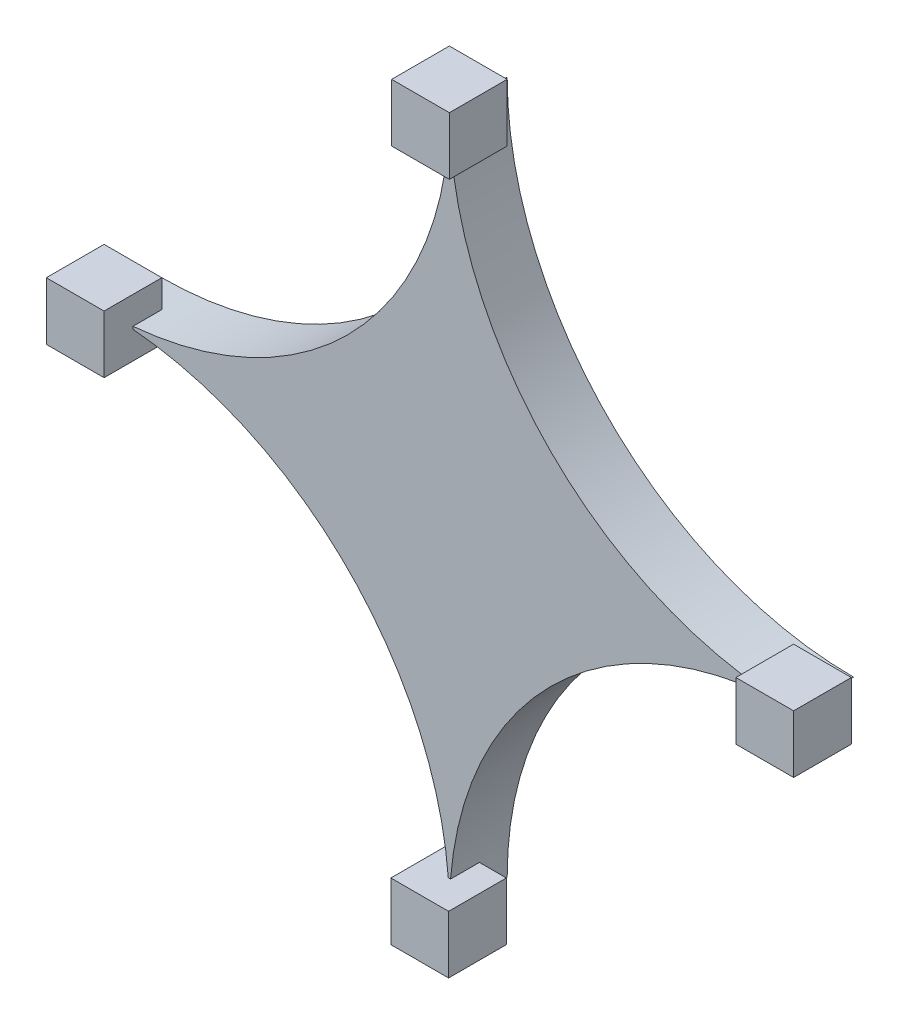
ISO-10303-21;
HEADER;
FILE_DESCRIPTION(('STEP AP214'),'2;1');
FILE_NAME('part.step','',(''),(''),'','','');
FILE_SCHEMA(('AUTOMOTIVE_DESIGN { 1 0 10303 214 1 1 1 1 }'));
ENDSEC;
DATA;
#1=APPLICATION_CONTEXT('core data for automotive mechanical design processes');
#2=APPLICATION_PROTOCOL_DEFINITION('international standard','automotive_design',2000,#1);
#3=PRODUCT_CONTEXT('',#1,'mechanical');
#4=PRODUCT('Part','Part','',(#3));
#5=PRODUCT_RELATED_PRODUCT_CATEGORY('part','',(#4));
#6=PRODUCT_DEFINITION_FORMATION('','',#4);
#7=PRODUCT_DEFINITION_CONTEXT('part definition',#1,'design');
#8=PRODUCT_DEFINITION('design','',#6,#7);
#9=PRODUCT_DEFINITION_SHAPE('','',#8);
#10=(LENGTH_UNIT() NAMED_UNIT(*) SI_UNIT(.MILLI.,.METRE.));
#11=(NAMED_UNIT(*) PLANE_ANGLE_UNIT() SI_UNIT($,.RADIAN.));
#12=(NAMED_UNIT(*) SI_UNIT($,.STERADIAN.) SOLID_ANGLE_UNIT());
#13=UNCERTAINTY_MEASURE_WITH_UNIT(LENGTH_MEASURE(1.E-05),#10,'distance_accuracy_value','');
#14=(GEOMETRIC_REPRESENTATION_CONTEXT(3) GLOBAL_UNCERTAINTY_ASSIGNED_CONTEXT((#13)) GLOBAL_UNIT_ASSIGNED_CONTEXT((#10,
#11,#12)) REPRESENTATION_CONTEXT('',''));
#15=CARTESIAN_POINT('',(0.,0.,0.));
#16=DIRECTION('',(0.,0.,1.));
#17=DIRECTION('',(1.,0.,0.));
#18=AXIS2_PLACEMENT_3D('',#15,#16,#17);
#19=CARTESIAN_POINT('',(-60.0000000000001,0.,10.));
#20=DIRECTION('',(0.,0.,1.));
#21=DIRECTION('',(1.,0.,0.));
#22=AXIS2_PLACEMENT_3D('',#19,#20,#21);
#23=PLANE('',#22);
#24=CARTESIAN_POINT('',(60.,60.,10.));
#25=DIRECTION('',(0.,0.,1.));
#26=DIRECTION('',(1.,0.,0.));
#27=AXIS2_PLACEMENT_3D('',#24,#25,#26);
#28=CIRCLE('',#27,60.);
#29=CARTESIAN_POINT('',(0.238878901161831,54.6513174509981,10.));
#30=VERTEX_POINT('',#29);
#31=CARTESIAN_POINT('',(54.6008487596363,0.243417384494973,10.));
#32=VERTEX_POINT('',#31);
#33=EDGE_CURVE('E380',#30,#32,#28,.T.);
#34=ORIENTED_EDGE('',*,*,#33,.F.);
#35=DIRECTION('',(-1.,0.,0.));
#36=VECTOR('',#35,1.);
#37=CARTESIAN_POINT('',(-60.0000000000001,54.6513174509981,10.));
#38=LINE('',#37,#36);
#39=CARTESIAN_POINT('',(-0.238878901161803,54.6513174509981,10.));
#40=VERTEX_POINT('',#39);
#41=EDGE_CURVE('E56',#30,#40,#38,.T.);
#42=ORIENTED_EDGE('',*,*,#41,.T.);
#43=CARTESIAN_POINT('',(-60.,60.,10.));
#44=DIRECTION('',(0.,0.,1.));
#45=DIRECTION('',(1.,0.,0.));
#46=AXIS2_PLACEMENT_3D('',#43,#44,#45);
#47=CIRCLE('',#46,60.);
#48=CARTESIAN_POINT('',(-54.7983305418478,0.225903312152609,10.));
#49=VERTEX_POINT('',#48);
#50=EDGE_CURVE('E377',#49,#40,#47,.T.);
#51=ORIENTED_EDGE('',*,*,#50,.F.);
#52=DIRECTION('',(0.,-1.,0.));
#53=VECTOR('',#52,1.);
#54=CARTESIAN_POINT('',(-54.7983305418478,0.,10.));
#55=LINE('',#54,#53);
#56=CARTESIAN_POINT('',(-54.7983305418478,-0.225903312152623,10.));
#57=VERTEX_POINT('',#56);
#58=EDGE_CURVE('E289',#49,#57,#55,.T.);
#59=ORIENTED_EDGE('',*,*,#58,.T.);
#60=CARTESIAN_POINT('',(-60.0000000000001,-60.0000000000001,10.));
#61=DIRECTION('',(0.,0.,1.));
#62=DIRECTION('',(1.,0.,0.));
#63=AXIS2_PLACEMENT_3D('',#60,#61,#62);
#64=CIRCLE('',#63,60.0000000000001);
#65=CARTESIAN_POINT('',(-0.193930264407352,-55.179831664617,10.));
#66=VERTEX_POINT('',#65);
#67=EDGE_CURVE('E374',#66,#57,#64,.T.);
#68=ORIENTED_EDGE('',*,*,#67,.F.);
#69=DIRECTION('',(1.,0.,0.));
#70=VECTOR('',#69,1.);
#71=CARTESIAN_POINT('',(-60.0000000000001,-55.179831664617,10.));
#72=LINE('',#71,#70);
#73=CARTESIAN_POINT('',(0.193930264407373,-55.179831664617,10.));
#74=VERTEX_POINT('',#73);
#75=EDGE_CURVE('E397',#66,#74,#72,.T.);
#76=ORIENTED_EDGE('',*,*,#75,.T.);
#77=CARTESIAN_POINT('',(60.0000000000001,-60.0000000000001,10.));
#78=DIRECTION('',(0.,0.,1.));
#79=DIRECTION('',(1.,0.,0.));
#80=AXIS2_PLACEMENT_3D('',#77,#78,#79);
#81=CIRCLE('',#80,60.0000000000001);
#82=CARTESIAN_POINT('',(54.6008487596363,-0.243417384494959,10.));
#83=VERTEX_POINT('',#82);
#84=EDGE_CURVE('E382',#83,#74,#81,.T.);
#85=ORIENTED_EDGE('',*,*,#84,.F.);
#86=DIRECTION('',(0.,1.,0.));
#87=VECTOR('',#86,1.);
#88=CARTESIAN_POINT('',(54.6008487596363,0.,10.));
#89=LINE('',#88,#87);
#90=EDGE_CURVE('E328',#83,#32,#89,.T.);
#91=ORIENTED_EDGE('',*,*,#90,.T.);
#92=EDGE_LOOP('',(#34,#42,#51,#59,#68,#76,#85,#91));
#93=FACE_BOUND('',#92,.T.);
#94=ADVANCED_FACE('F33',(#93),#23,.T.);
#95=CARTESIAN_POINT('',(-60.,60.,10.));
#96=DIRECTION('',(0.,0.,-1.));
#97=DIRECTION('',(-1.,0.,0.));
#98=AXIS2_PLACEMENT_3D('',#95,#96,#97);
#99=CYLINDRICAL_SURFACE('',#98,60.);
#100=ORIENTED_EDGE('',*,*,#50,.T.);
#101=DIRECTION('',(0.,0.,-1.));
#102=VECTOR('',#101,1.);
#103=CARTESIAN_POINT('',(-0.238878901161803,54.6513174509981,10.));
#104=LINE('',#103,#102);
#105=CARTESIAN_POINT('',(-0.238878901161803,54.6513174509981,5.));
#106=VERTEX_POINT('',#105);
#107=EDGE_CURVE('E48',#40,#106,#104,.T.);
#108=ORIENTED_EDGE('',*,*,#107,.T.);
#109=CARTESIAN_POINT('',(-60.,60.,5.));
#110=DIRECTION('',(0.,0.,-1.));
#111=DIRECTION('',(-1.,0.,0.));
#112=AXIS2_PLACEMENT_3D('',#109,#110,#111);
#113=CIRCLE('',#112,60.);
#114=CARTESIAN_POINT('',(0.,60.,5.));
#115=VERTEX_POINT('',#114);
#116=EDGE_CURVE('E245',#115,#106,#113,.T.);
#117=ORIENTED_EDGE('',*,*,#116,.F.);
#118=DIRECTION('',(0.,0.,-1.));
#119=VECTOR('',#118,1.);
#120=CARTESIAN_POINT('',(0.,60.,10.));
#121=LINE('',#120,#119);
#122=CARTESIAN_POINT('',(0.,60.,0.));
#123=VERTEX_POINT('',#122);
#124=EDGE_CURVE('E400',#115,#123,#121,.T.);
#125=ORIENTED_EDGE('',*,*,#124,.T.);
#126=CARTESIAN_POINT('',(-60.,60.,0.));
#127=DIRECTION('',(0.,0.,1.));
#128=DIRECTION('',(1.,0.,0.));
#129=AXIS2_PLACEMENT_3D('',#126,#127,#128);
#130=CIRCLE('',#129,60.);
#131=CARTESIAN_POINT('',(-60.,0.,0.));
#132=VERTEX_POINT('',#131);
#133=EDGE_CURVE('E387',#132,#123,#130,.T.);
#134=ORIENTED_EDGE('',*,*,#133,.F.);
#135=DIRECTION('',(0.,0.,-1.));
#136=VECTOR('',#135,1.);
#137=CARTESIAN_POINT('',(-60.,0.,10.));
#138=LINE('',#137,#136);
#139=CARTESIAN_POINT('',(-60.,0.,5.));
#140=VERTEX_POINT('',#139);
#141=EDGE_CURVE('E384',#140,#132,#138,.T.);
#142=ORIENTED_EDGE('',*,*,#141,.F.);
#143=CARTESIAN_POINT('',(-60.,60.,5.));
#144=DIRECTION('',(0.,0.,-1.));
#145=DIRECTION('',(-1.,0.,0.));
#146=AXIS2_PLACEMENT_3D('',#143,#144,#145);
#147=CIRCLE('',#146,60.);
#148=CARTESIAN_POINT('',(-54.7983305418478,0.225903312152623,5.));
#149=VERTEX_POINT('',#148);
#150=EDGE_CURVE('E412',#149,#140,#147,.T.);
#151=ORIENTED_EDGE('',*,*,#150,.F.);
#152=DIRECTION('',(0.,0.,-1.));
#153=VECTOR('',#152,1.);
#154=CARTESIAN_POINT('',(-54.7983305418478,0.225903312152623,10.));
#155=LINE('',#154,#153);
#156=EDGE_CURVE('E415',#149,#49,#155,.F.);
#157=ORIENTED_EDGE('',*,*,#156,.T.);
#158=EDGE_LOOP('',(#100,#108,#117,#125,#134,#142,#151,#157));
#159=FACE_BOUND('',#158,.T.);
#160=ADVANCED_FACE('F453',(#159),#99,.F.);
#161=CARTESIAN_POINT('',(60.,60.,10.));
#162=DIRECTION('',(0.,0.,-1.));
#163=DIRECTION('',(-1.,0.,0.));
#164=AXIS2_PLACEMENT_3D('',#161,#162,#163);
#165=CYLINDRICAL_SURFACE('',#164,60.);
#166=CARTESIAN_POINT('',(60.,60.,5.));
#167=DIRECTION('',(0.,0.,-1.));
#168=DIRECTION('',(-1.,0.,0.));
#169=AXIS2_PLACEMENT_3D('',#166,#167,#168);
#170=CIRCLE('',#169,60.);
#171=CARTESIAN_POINT('',(0.238878901161831,54.6513174509981,5.));
#172=VERTEX_POINT('',#171);
#173=EDGE_CURVE('E41',#172,#115,#170,.T.);
#174=ORIENTED_EDGE('',*,*,#173,.F.);
#175=DIRECTION('',(0.,0.,-1.));
#176=VECTOR('',#175,1.);
#177=CARTESIAN_POINT('',(0.238878901161831,54.6513174509981,10.));
#178=LINE('',#177,#176);
#179=EDGE_CURVE('E11',#172,#30,#178,.F.);
#180=ORIENTED_EDGE('',*,*,#179,.T.);
#181=ORIENTED_EDGE('',*,*,#33,.T.);
#182=DIRECTION('',(0.,0.,-1.));
#183=VECTOR('',#182,1.);
#184=CARTESIAN_POINT('',(54.6008487596363,0.243417384494973,10.));
#185=LINE('',#184,#183);
#186=CARTESIAN_POINT('',(54.6008487596363,0.243417384494973,5.));
#187=VERTEX_POINT('',#186);
#188=EDGE_CURVE('E410',#32,#187,#185,.T.);
#189=ORIENTED_EDGE('',*,*,#188,.T.);
#190=CARTESIAN_POINT('',(60.,60.,5.));
#191=DIRECTION('',(0.,0.,-1.));
#192=DIRECTION('',(-1.,0.,0.));
#193=AXIS2_PLACEMENT_3D('',#190,#191,#192);
#194=CIRCLE('',#193,60.);
#195=CARTESIAN_POINT('',(60.,0.,5.));
#196=VERTEX_POINT('',#195);
#197=EDGE_CURVE('E407',#196,#187,#194,.T.);
#198=ORIENTED_EDGE('',*,*,#197,.F.);
#199=DIRECTION('',(0.,0.,-1.));
#200=VECTOR('',#199,1.);
#201=CARTESIAN_POINT('',(60.,0.,10.));
#202=LINE('',#201,#200);
#203=CARTESIAN_POINT('',(60.,0.,0.));
#204=VERTEX_POINT('',#203);
#205=EDGE_CURVE('E398',#196,#204,#202,.T.);
#206=ORIENTED_EDGE('',*,*,#205,.T.);
#207=CARTESIAN_POINT('',(60.,60.,0.));
#208=DIRECTION('',(0.,0.,1.));
#209=DIRECTION('',(1.,0.,0.));
#210=AXIS2_PLACEMENT_3D('',#207,#208,#209);
#211=CIRCLE('',#210,60.);
#212=EDGE_CURVE('E390',#123,#204,#211,.T.);
#213=ORIENTED_EDGE('',*,*,#212,.F.);
#214=ORIENTED_EDGE('',*,*,#124,.F.);
#215=EDGE_LOOP('',(#174,#180,#181,#189,#198,#206,#213,#214));
#216=FACE_BOUND('',#215,.T.);
#217=ADVANCED_FACE('F425',(#216),#165,.F.);
#218=CARTESIAN_POINT('',(-60.0000000000001,-60.0000000000001,10.));
#219=DIRECTION('',(0.,0.,-1.));
#220=DIRECTION('',(-1.,0.,0.));
#221=AXIS2_PLACEMENT_3D('',#218,#219,#220);
#222=CYLINDRICAL_SURFACE('',#221,60.0000000000001);
#223=ORIENTED_EDGE('',*,*,#67,.T.);
#224=DIRECTION('',(0.,0.,-1.));
#225=VECTOR('',#224,1.);
#226=CARTESIAN_POINT('',(-54.7983305418478,-0.225903312152637,10.));
#227=LINE('',#226,#225);
#228=CARTESIAN_POINT('',(-54.7983305418478,-0.225903312152637,5.));
#229=VERTEX_POINT('',#228);
#230=EDGE_CURVE('E291',#57,#229,#227,.T.);
#231=ORIENTED_EDGE('',*,*,#230,.T.);
#232=CARTESIAN_POINT('',(-60.0000000000001,-60.0000000000001,5.));
#233=DIRECTION('',(0.,0.,-1.));
#234=DIRECTION('',(-1.,0.,0.));
#235=AXIS2_PLACEMENT_3D('',#232,#233,#234);
#236=CIRCLE('',#235,60.0000000000001);
#237=EDGE_CURVE('E286',#140,#229,#236,.T.);
#238=ORIENTED_EDGE('',*,*,#237,.F.);
#239=ORIENTED_EDGE('',*,*,#141,.T.);
#240=CARTESIAN_POINT('',(-60.0000000000001,-60.0000000000001,0.));
#241=DIRECTION('',(0.,0.,1.));
#242=DIRECTION('',(1.,0.,0.));
#243=AXIS2_PLACEMENT_3D('',#240,#241,#242);
#244=CIRCLE('',#243,60.0000000000001);
#245=CARTESIAN_POINT('',(0.,-60.,0.));
#246=VERTEX_POINT('',#245);
#247=EDGE_CURVE('E373',#246,#132,#244,.T.);
#248=ORIENTED_EDGE('',*,*,#247,.F.);
#249=DIRECTION('',(0.,0.,-1.));
#250=VECTOR('',#249,1.);
#251=CARTESIAN_POINT('',(0.,-60.,10.));
#252=LINE('',#251,#250);
#253=CARTESIAN_POINT('',(0.,-60.0000000000001,5.));
#254=VERTEX_POINT('',#253);
#255=EDGE_CURVE('E395',#254,#246,#252,.T.);
#256=ORIENTED_EDGE('',*,*,#255,.F.);
#257=CARTESIAN_POINT('',(-60.0000000000001,-60.0000000000001,5.));
#258=DIRECTION('',(0.,0.,-1.));
#259=DIRECTION('',(-1.,0.,0.));
#260=AXIS2_PLACEMENT_3D('',#257,#258,#259);
#261=CIRCLE('',#260,60.0000000000001);
#262=CARTESIAN_POINT('',(-0.193930264407352,-55.179831664617,5.));
#263=VERTEX_POINT('',#262);
#264=EDGE_CURVE('E371',#263,#254,#261,.T.);
#265=ORIENTED_EDGE('',*,*,#264,.F.);
#266=DIRECTION('',(0.,0.,-1.));
#267=VECTOR('',#266,1.);
#268=CARTESIAN_POINT('',(-0.193930264407352,-55.179831664617,10.));
#269=LINE('',#268,#267);
#270=EDGE_CURVE('E368',#263,#66,#269,.F.);
#271=ORIENTED_EDGE('',*,*,#270,.T.);
#272=EDGE_LOOP('',(#223,#231,#238,#239,#248,#256,#265,#271));
#273=FACE_BOUND('',#272,.T.);
#274=ADVANCED_FACE('F35',(#273),#222,.F.);
#275=CARTESIAN_POINT('',(60.0000000000001,-60.0000000000001,10.));
#276=DIRECTION('',(0.,0.,-1.));
#277=DIRECTION('',(-1.,0.,0.));
#278=AXIS2_PLACEMENT_3D('',#275,#276,#277);
#279=CYLINDRICAL_SURFACE('',#278,60.0000000000001);
#280=CARTESIAN_POINT('',(60.0000000000001,-60.0000000000001,5.));
#281=DIRECTION('',(0.,0.,-1.));
#282=DIRECTION('',(-1.,0.,0.));
#283=AXIS2_PLACEMENT_3D('',#280,#281,#282);
#284=CIRCLE('',#283,60.0000000000001);
#285=CARTESIAN_POINT('',(54.6008487596363,-0.243417384494959,5.));
#286=VERTEX_POINT('',#285);
#287=EDGE_CURVE('E325',#286,#196,#284,.T.);
#288=ORIENTED_EDGE('',*,*,#287,.F.);
#289=DIRECTION('',(0.,0.,-1.));
#290=VECTOR('',#289,1.);
#291=CARTESIAN_POINT('',(54.6008487596363,-0.243417384494959,10.));
#292=LINE('',#291,#290);
#293=EDGE_CURVE('E331',#286,#83,#292,.F.);
#294=ORIENTED_EDGE('',*,*,#293,.T.);
#295=ORIENTED_EDGE('',*,*,#84,.T.);
#296=DIRECTION('',(0.,0.,-1.));
#297=VECTOR('',#296,1.);
#298=CARTESIAN_POINT('',(0.193930264407373,-55.179831664617,10.));
#299=LINE('',#298,#297);
#300=CARTESIAN_POINT('',(0.193930264407373,-55.179831664617,5.));
#301=VERTEX_POINT('',#300);
#302=EDGE_CURVE('E365',#74,#301,#299,.T.);
#303=ORIENTED_EDGE('',*,*,#302,.T.);
#304=CARTESIAN_POINT('',(60.0000000000001,-60.0000000000001,5.));
#305=DIRECTION('',(0.,0.,-1.));
#306=DIRECTION('',(-1.,0.,0.));
#307=AXIS2_PLACEMENT_3D('',#304,#305,#306);
#308=CIRCLE('',#307,60.0000000000001);
#309=EDGE_CURVE('E405',#254,#301,#308,.T.);
#310=ORIENTED_EDGE('',*,*,#309,.F.);
#311=ORIENTED_EDGE('',*,*,#255,.T.);
#312=CARTESIAN_POINT('',(60.0000000000001,-60.0000000000001,0.));
#313=DIRECTION('',(0.,0.,1.));
#314=DIRECTION('',(1.,0.,0.));
#315=AXIS2_PLACEMENT_3D('',#312,#313,#314);
#316=CIRCLE('',#315,60.0000000000001);
#317=EDGE_CURVE('E378',#204,#246,#316,.T.);
#318=ORIENTED_EDGE('',*,*,#317,.F.);
#319=ORIENTED_EDGE('',*,*,#205,.F.);
#320=EDGE_LOOP('',(#288,#294,#295,#303,#310,#311,#318,#319));
#321=FACE_BOUND('',#320,.T.);
#322=ADVANCED_FACE('F466',(#321),#279,.F.);
#323=CARTESIAN_POINT('',(-60.0000000000001,0.,0.));
#324=DIRECTION('',(0.,0.,1.));
#325=DIRECTION('',(1.,0.,0.));
#326=AXIS2_PLACEMENT_3D('',#323,#324,#325);
#327=PLANE('',#326);
#328=ORIENTED_EDGE('',*,*,#247,.T.);
#329=ORIENTED_EDGE('',*,*,#133,.T.);
#330=ORIENTED_EDGE('',*,*,#212,.T.);
#331=ORIENTED_EDGE('',*,*,#317,.T.);
#332=EDGE_LOOP('',(#328,#329,#330,#331));
#333=FACE_BOUND('',#332,.T.);
#334=ADVANCED_FACE('F462',(#333),#327,.F.);
#335=CARTESIAN_POINT('',(0.,0.,5.));
#336=DIRECTION('',(0.,0.,-1.));
#337=DIRECTION('',(-1.,0.,0.));
#338=AXIS2_PLACEMENT_3D('',#335,#336,#337);
#339=PLANE('',#338);
#340=DIRECTION('',(-1.,0.,0.));
#341=VECTOR('',#340,1.);
#342=CARTESIAN_POINT('',(4.85863422704114,-55.179831664617,5.));
#343=LINE('',#342,#341);
#344=CARTESIAN_POINT('',(-5.14136577295886,-55.179831664617,5.));
#345=VERTEX_POINT('',#344);
#346=EDGE_CURVE('E347',#263,#345,#343,.T.);
#347=ORIENTED_EDGE('',*,*,#346,.F.);
#348=ORIENTED_EDGE('',*,*,#264,.T.);
#349=ORIENTED_EDGE('',*,*,#309,.T.);
#350=CARTESIAN_POINT('',(4.85863422704114,-55.179831664617,5.));
#351=VERTEX_POINT('',#350);
#352=EDGE_CURVE('E348',#351,#301,#343,.T.);
#353=ORIENTED_EDGE('',*,*,#352,.F.);
#354=DIRECTION('',(0.,1.,0.));
#355=VECTOR('',#354,1.);
#356=CARTESIAN_POINT('',(4.85863422704114,-55.179831664617,5.));
#357=LINE('',#356,#355);
#358=CARTESIAN_POINT('',(4.85863422704114,-65.1798316646171,5.));
#359=VERTEX_POINT('',#358);
#360=EDGE_CURVE('E333',#359,#351,#357,.T.);
#361=ORIENTED_EDGE('',*,*,#360,.F.);
#362=DIRECTION('',(1.,0.,0.));
#363=VECTOR('',#362,1.);
#364=CARTESIAN_POINT('',(4.85863422704114,-65.1798316646171,5.));
#365=LINE('',#364,#363);
#366=CARTESIAN_POINT('',(-5.14136577295886,-65.1798316646171,5.));
#367=VERTEX_POINT('',#366);
#368=EDGE_CURVE('E338',#367,#359,#365,.T.);
#369=ORIENTED_EDGE('',*,*,#368,.F.);
#370=DIRECTION('',(0.,-1.,0.));
#371=VECTOR('',#370,1.);
#372=CARTESIAN_POINT('',(-5.14136577295886,-55.179831664617,5.));
#373=LINE('',#372,#371);
#374=EDGE_CURVE('E351',#345,#367,#373,.T.);
#375=ORIENTED_EDGE('',*,*,#374,.F.);
#376=EDGE_LOOP('',(#347,#348,#349,#353,#361,#369,#375));
#377=FACE_BOUND('',#376,.T.);
#378=ADVANCED_FACE('F465',(#377),#339,.T.);
#379=CARTESIAN_POINT('',(4.85863422704114,-55.179831664617,15.));
#380=DIRECTION('',(-1.,0.,0.));
#381=DIRECTION('',(0.,0.,1.));
#382=AXIS2_PLACEMENT_3D('',#379,#380,#381);
#383=PLANE('',#382);
#384=ORIENTED_EDGE('',*,*,#360,.T.);
#385=DIRECTION('',(0.,0.,-1.));
#386=VECTOR('',#385,1.);
#387=CARTESIAN_POINT('',(4.85863422704114,-55.179831664617,15.));
#388=LINE('',#387,#386);
#389=CARTESIAN_POINT('',(4.85863422704114,-55.179831664617,15.));
#390=VERTEX_POINT('',#389);
#391=EDGE_CURVE('E362',#390,#351,#388,.T.);
#392=ORIENTED_EDGE('',*,*,#391,.F.);
#393=DIRECTION('',(0.,1.,0.));
#394=VECTOR('',#393,1.);
#395=CARTESIAN_POINT('',(4.85863422704114,-55.179831664617,15.));
#396=LINE('',#395,#394);
#397=CARTESIAN_POINT('',(4.85863422704114,-65.1798316646171,15.));
#398=VERTEX_POINT('',#397);
#399=EDGE_CURVE('E334',#398,#390,#396,.T.);
#400=ORIENTED_EDGE('',*,*,#399,.F.);
#401=DIRECTION('',(0.,0.,-1.));
#402=VECTOR('',#401,1.);
#403=CARTESIAN_POINT('',(4.85863422704114,-65.1798316646171,15.));
#404=LINE('',#403,#402);
#405=EDGE_CURVE('E344',#398,#359,#404,.T.);
#406=ORIENTED_EDGE('',*,*,#405,.T.);
#407=EDGE_LOOP('',(#384,#392,#400,#406));
#408=FACE_BOUND('',#407,.T.);
#409=ADVANCED_FACE('F460',(#408),#383,.F.);
#410=CARTESIAN_POINT('',(4.85863422704114,-55.179831664617,15.));
#411=DIRECTION('',(0.,-1.,0.));
#412=DIRECTION('',(0.,0.,-1.));
#413=AXIS2_PLACEMENT_3D('',#410,#411,#412);
#414=PLANE('',#413);
#415=ORIENTED_EDGE('',*,*,#270,.F.);
#416=ORIENTED_EDGE('',*,*,#346,.T.);
#417=DIRECTION('',(0.,0.,-1.));
#418=VECTOR('',#417,1.);
#419=CARTESIAN_POINT('',(-5.14136577295886,-55.179831664617,15.));
#420=LINE('',#419,#418);
#421=CARTESIAN_POINT('',(-5.14136577295886,-55.179831664617,15.));
#422=VERTEX_POINT('',#421);
#423=EDGE_CURVE('E359',#422,#345,#420,.T.);
#424=ORIENTED_EDGE('',*,*,#423,.F.);
#425=DIRECTION('',(-1.,0.,0.));
#426=VECTOR('',#425,1.);
#427=CARTESIAN_POINT('',(4.85863422704114,-55.179831664617,15.));
#428=LINE('',#427,#426);
#429=EDGE_CURVE('E337',#390,#422,#428,.T.);
#430=ORIENTED_EDGE('',*,*,#429,.F.);
#431=ORIENTED_EDGE('',*,*,#391,.T.);
#432=ORIENTED_EDGE('',*,*,#352,.T.);
#433=ORIENTED_EDGE('',*,*,#302,.F.);
#434=ORIENTED_EDGE('',*,*,#75,.F.);
#435=EDGE_LOOP('',(#415,#416,#424,#430,#431,#432,#433,#434));
#436=FACE_BOUND('',#435,.T.);
#437=ADVANCED_FACE('F505',(#436),#414,.F.);
#438=CARTESIAN_POINT('',(-5.14136577295886,-55.179831664617,15.));
#439=DIRECTION('',(1.,0.,0.));
#440=DIRECTION('',(0.,1.,0.));
#441=AXIS2_PLACEMENT_3D('',#438,#439,#440);
#442=PLANE('',#441);
#443=ORIENTED_EDGE('',*,*,#374,.T.);
#444=DIRECTION('',(0.,0.,-1.));
#445=VECTOR('',#444,1.);
#446=CARTESIAN_POINT('',(-5.14136577295886,-65.1798316646171,15.));
#447=LINE('',#446,#445);
#448=CARTESIAN_POINT('',(-5.14136577295886,-65.1798316646171,15.));
#449=VERTEX_POINT('',#448);
#450=EDGE_CURVE('E356',#449,#367,#447,.T.);
#451=ORIENTED_EDGE('',*,*,#450,.F.);
#452=DIRECTION('',(0.,-1.,0.));
#453=VECTOR('',#452,1.);
#454=CARTESIAN_POINT('',(-5.14136577295886,-55.179831664617,15.));
#455=LINE('',#454,#453);
#456=EDGE_CURVE('E340',#422,#449,#455,.T.);
#457=ORIENTED_EDGE('',*,*,#456,.F.);
#458=ORIENTED_EDGE('',*,*,#423,.T.);
#459=EDGE_LOOP('',(#443,#451,#457,#458));
#460=FACE_BOUND('',#459,.T.);
#461=ADVANCED_FACE('F508',(#460),#442,.F.);
#462=CARTESIAN_POINT('',(4.85863422704114,-65.1798316646171,15.));
#463=DIRECTION('',(0.,1.,0.));
#464=DIRECTION('',(0.,0.,1.));
#465=AXIS2_PLACEMENT_3D('',#462,#463,#464);
#466=PLANE('',#465);
#467=ORIENTED_EDGE('',*,*,#368,.T.);
#468=ORIENTED_EDGE('',*,*,#405,.F.);
#469=DIRECTION('',(1.,0.,0.));
#470=VECTOR('',#469,1.);
#471=CARTESIAN_POINT('',(4.85863422704114,-65.1798316646171,15.));
#472=LINE('',#471,#470);
#473=EDGE_CURVE('E342',#449,#398,#472,.T.);
#474=ORIENTED_EDGE('',*,*,#473,.F.);
#475=ORIENTED_EDGE('',*,*,#450,.T.);
#476=EDGE_LOOP('',(#467,#468,#474,#475));
#477=FACE_BOUND('',#476,.T.);
#478=ADVANCED_FACE('F520',(#477),#466,.F.);
#479=CARTESIAN_POINT('',(0.,0.,15.));
#480=DIRECTION('',(0.,0.,-1.));
#481=DIRECTION('',(-1.,0.,0.));
#482=AXIS2_PLACEMENT_3D('',#479,#480,#481);
#483=PLANE('',#482);
#484=ORIENTED_EDGE('',*,*,#399,.T.);
#485=ORIENTED_EDGE('',*,*,#429,.T.);
#486=ORIENTED_EDGE('',*,*,#456,.T.);
#487=ORIENTED_EDGE('',*,*,#473,.T.);
#488=EDGE_LOOP('',(#484,#485,#486,#487));
#489=FACE_BOUND('',#488,.T.);
#490=ADVANCED_FACE('F512',(#489),#483,.F.);
#491=CARTESIAN_POINT('',(0.,0.,5.));
#492=DIRECTION('',(0.,0.,-1.));
#493=DIRECTION('',(-1.,0.,0.));
#494=AXIS2_PLACEMENT_3D('',#491,#492,#493);
#495=PLANE('',#494);
#496=DIRECTION('',(0.,-1.,0.));
#497=VECTOR('',#496,1.);
#498=CARTESIAN_POINT('',(54.6008487596363,4.75538839912758,5.));
#499=LINE('',#498,#497);
#500=CARTESIAN_POINT('',(54.6008487596363,-5.24461160087242,5.));
#501=VERTEX_POINT('',#500);
#502=EDGE_CURVE('E309',#286,#501,#499,.T.);
#503=ORIENTED_EDGE('',*,*,#502,.F.);
#504=ORIENTED_EDGE('',*,*,#287,.T.);
#505=ORIENTED_EDGE('',*,*,#197,.T.);
#506=CARTESIAN_POINT('',(54.6008487596363,4.75538839912758,5.));
#507=VERTEX_POINT('',#506);
#508=EDGE_CURVE('E310',#507,#187,#499,.T.);
#509=ORIENTED_EDGE('',*,*,#508,.F.);
#510=DIRECTION('',(-1.,0.,0.));
#511=VECTOR('',#510,1.);
#512=CARTESIAN_POINT('',(64.6008487596363,4.75538839912758,5.));
#513=LINE('',#512,#511);
#514=CARTESIAN_POINT('',(64.6008487596363,4.75538839912758,5.));
#515=VERTEX_POINT('',#514);
#516=EDGE_CURVE('E307',#515,#507,#513,.T.);
#517=ORIENTED_EDGE('',*,*,#516,.F.);
#518=DIRECTION('',(0.,1.,0.));
#519=VECTOR('',#518,1.);
#520=CARTESIAN_POINT('',(64.6008487596363,4.75538839912758,5.));
#521=LINE('',#520,#519);
#522=CARTESIAN_POINT('',(64.6008487596363,-5.24461160087242,5.));
#523=VERTEX_POINT('',#522);
#524=EDGE_CURVE('E293',#523,#515,#521,.T.);
#525=ORIENTED_EDGE('',*,*,#524,.F.);
#526=DIRECTION('',(1.,0.,0.));
#527=VECTOR('',#526,1.);
#528=CARTESIAN_POINT('',(64.6008487596363,-5.24461160087242,5.));
#529=LINE('',#528,#527);
#530=EDGE_CURVE('E298',#501,#523,#529,.T.);
#531=ORIENTED_EDGE('',*,*,#530,.F.);
#532=EDGE_LOOP('',(#503,#504,#505,#509,#517,#525,#531));
#533=FACE_BOUND('',#532,.T.);
#534=ADVANCED_FACE('F527',(#533),#495,.T.);
#535=CARTESIAN_POINT('',(64.6008487596363,4.75538839912758,15.));
#536=DIRECTION('',(-1.,0.,0.));
#537=DIRECTION('',(0.,0.,1.));
#538=AXIS2_PLACEMENT_3D('',#535,#536,#537);
#539=PLANE('',#538);
#540=ORIENTED_EDGE('',*,*,#524,.T.);
#541=DIRECTION('',(0.,0.,-1.));
#542=VECTOR('',#541,1.);
#543=CARTESIAN_POINT('',(64.6008487596363,4.75538839912758,15.));
#544=LINE('',#543,#542);
#545=CARTESIAN_POINT('',(64.6008487596363,4.75538839912758,15.));
#546=VERTEX_POINT('',#545);
#547=EDGE_CURVE('E322',#546,#515,#544,.T.);
#548=ORIENTED_EDGE('',*,*,#547,.F.);
#549=DIRECTION('',(0.,1.,0.));
#550=VECTOR('',#549,1.);
#551=CARTESIAN_POINT('',(64.6008487596363,4.75538839912758,15.));
#552=LINE('',#551,#550);
#553=CARTESIAN_POINT('',(64.6008487596363,-5.24461160087242,15.));
#554=VERTEX_POINT('',#553);
#555=EDGE_CURVE('E294',#554,#546,#552,.T.);
#556=ORIENTED_EDGE('',*,*,#555,.F.);
#557=DIRECTION('',(0.,0.,-1.));
#558=VECTOR('',#557,1.);
#559=CARTESIAN_POINT('',(64.6008487596363,-5.24461160087242,15.));
#560=LINE('',#559,#558);
#561=EDGE_CURVE('E304',#554,#523,#560,.T.);
#562=ORIENTED_EDGE('',*,*,#561,.T.);
#563=EDGE_LOOP('',(#540,#548,#556,#562));
#564=FACE_BOUND('',#563,.T.);
#565=ADVANCED_FACE('F600',(#564),#539,.F.);
#566=CARTESIAN_POINT('',(64.6008487596363,4.75538839912758,15.));
#567=DIRECTION('',(0.,-1.,0.));
#568=DIRECTION('',(0.,0.,-1.));
#569=AXIS2_PLACEMENT_3D('',#566,#567,#568);
#570=PLANE('',#569);
#571=ORIENTED_EDGE('',*,*,#516,.T.);
#572=DIRECTION('',(0.,0.,-1.));
#573=VECTOR('',#572,1.);
#574=CARTESIAN_POINT('',(54.6008487596363,4.75538839912758,15.));
#575=LINE('',#574,#573);
#576=CARTESIAN_POINT('',(54.6008487596363,4.75538839912758,15.));
#577=VERTEX_POINT('',#576);
#578=EDGE_CURVE('E319',#577,#507,#575,.T.);
#579=ORIENTED_EDGE('',*,*,#578,.F.);
#580=DIRECTION('',(-1.,0.,0.));
#581=VECTOR('',#580,1.);
#582=CARTESIAN_POINT('',(64.6008487596363,4.75538839912758,15.));
#583=LINE('',#582,#581);
#584=EDGE_CURVE('E297',#546,#577,#583,.T.);
#585=ORIENTED_EDGE('',*,*,#584,.F.);
#586=ORIENTED_EDGE('',*,*,#547,.T.);
#587=EDGE_LOOP('',(#571,#579,#585,#586));
#588=FACE_BOUND('',#587,.T.);
#589=ADVANCED_FACE('F609',(#588),#570,.F.);
#590=CARTESIAN_POINT('',(54.6008487596363,4.75538839912758,15.));
#591=DIRECTION('',(1.,0.,0.));
#592=DIRECTION('',(0.,0.,-1.));
#593=AXIS2_PLACEMENT_3D('',#590,#591,#592);
#594=PLANE('',#593);
#595=ORIENTED_EDGE('',*,*,#293,.F.);
#596=ORIENTED_EDGE('',*,*,#502,.T.);
#597=DIRECTION('',(0.,0.,-1.));
#598=VECTOR('',#597,1.);
#599=CARTESIAN_POINT('',(54.6008487596363,-5.24461160087242,15.));
#600=LINE('',#599,#598);
#601=CARTESIAN_POINT('',(54.6008487596363,-5.24461160087242,15.));
#602=VERTEX_POINT('',#601);
#603=EDGE_CURVE('E316',#602,#501,#600,.T.);
#604=ORIENTED_EDGE('',*,*,#603,.F.);
#605=DIRECTION('',(0.,-1.,0.));
#606=VECTOR('',#605,1.);
#607=CARTESIAN_POINT('',(54.6008487596363,4.75538839912758,15.));
#608=LINE('',#607,#606);
#609=EDGE_CURVE('E300',#577,#602,#608,.T.);
#610=ORIENTED_EDGE('',*,*,#609,.F.);
#611=ORIENTED_EDGE('',*,*,#578,.T.);
#612=ORIENTED_EDGE('',*,*,#508,.T.);
#613=ORIENTED_EDGE('',*,*,#188,.F.);
#614=ORIENTED_EDGE('',*,*,#90,.F.);
#615=EDGE_LOOP('',(#595,#596,#604,#610,#611,#612,#613,#614));
#616=FACE_BOUND('',#615,.T.);
#617=ADVANCED_FACE('F618',(#616),#594,.F.);
#618=CARTESIAN_POINT('',(64.6008487596363,-5.24461160087242,15.));
#619=DIRECTION('',(0.,1.,0.));
#620=DIRECTION('',(-1.,0.,0.));
#621=AXIS2_PLACEMENT_3D('',#618,#619,#620);
#622=PLANE('',#621);
#623=ORIENTED_EDGE('',*,*,#530,.T.);
#624=ORIENTED_EDGE('',*,*,#561,.F.);
#625=DIRECTION('',(1.,0.,0.));
#626=VECTOR('',#625,1.);
#627=CARTESIAN_POINT('',(64.6008487596363,-5.24461160087242,15.));
#628=LINE('',#627,#626);
#629=EDGE_CURVE('E302',#602,#554,#628,.T.);
#630=ORIENTED_EDGE('',*,*,#629,.F.);
#631=ORIENTED_EDGE('',*,*,#603,.T.);
#632=EDGE_LOOP('',(#623,#624,#630,#631));
#633=FACE_BOUND('',#632,.T.);
#634=ADVANCED_FACE('F627',(#633),#622,.F.);
#635=CARTESIAN_POINT('',(0.,0.,15.));
#636=DIRECTION('',(0.,0.,-1.));
#637=DIRECTION('',(-1.,0.,0.));
#638=AXIS2_PLACEMENT_3D('',#635,#636,#637);
#639=PLANE('',#638);
#640=ORIENTED_EDGE('',*,*,#555,.T.);
#641=ORIENTED_EDGE('',*,*,#584,.T.);
#642=ORIENTED_EDGE('',*,*,#609,.T.);
#643=ORIENTED_EDGE('',*,*,#629,.T.);
#644=EDGE_LOOP('',(#640,#641,#642,#643));
#645=FACE_BOUND('',#644,.T.);
#646=ADVANCED_FACE('F636',(#645),#639,.F.);
#647=CARTESIAN_POINT('',(0.,0.,5.));
#648=DIRECTION('',(0.,0.,-1.));
#649=DIRECTION('',(-1.,0.,0.));
#650=AXIS2_PLACEMENT_3D('',#647,#648,#649);
#651=PLANE('',#650);
#652=ORIENTED_EDGE('',*,*,#150,.T.);
#653=ORIENTED_EDGE('',*,*,#237,.T.);
#654=DIRECTION('',(0.,1.,0.));
#655=VECTOR('',#654,1.);
#656=CARTESIAN_POINT('',(-54.7983305418478,-4.99042116994474,5.));
#657=LINE('',#656,#655);
#658=CARTESIAN_POINT('',(-54.7983305418478,-4.99042116994474,5.));
#659=VERTEX_POINT('',#658);
#660=EDGE_CURVE('E271',#659,#229,#657,.T.);
#661=ORIENTED_EDGE('',*,*,#660,.F.);
#662=DIRECTION('',(1.,0.,0.));
#663=VECTOR('',#662,1.);
#664=CARTESIAN_POINT('',(-64.7983305418478,-4.99042116994474,5.));
#665=LINE('',#664,#663);
#666=CARTESIAN_POINT('',(-64.7983305418478,-4.99042116994474,5.));
#667=VERTEX_POINT('',#666);
#668=EDGE_CURVE('E268',#667,#659,#665,.T.);
#669=ORIENTED_EDGE('',*,*,#668,.F.);
#670=DIRECTION('',(0.,-1.,0.));
#671=VECTOR('',#670,1.);
#672=CARTESIAN_POINT('',(-64.7983305418478,-4.99042116994474,5.));
#673=LINE('',#672,#671);
#674=CARTESIAN_POINT('',(-64.7983305418478,5.00957883005526,5.));
#675=VERTEX_POINT('',#674);
#676=EDGE_CURVE('E254',#675,#667,#673,.T.);
#677=ORIENTED_EDGE('',*,*,#676,.F.);
#678=DIRECTION('',(-1.,0.,0.));
#679=VECTOR('',#678,1.);
#680=CARTESIAN_POINT('',(-64.7983305418478,5.00957883005526,5.));
#681=LINE('',#680,#679);
#682=CARTESIAN_POINT('',(-54.7983305418478,5.00957883005526,5.));
#683=VERTEX_POINT('',#682);
#684=EDGE_CURVE('E259',#683,#675,#681,.T.);
#685=ORIENTED_EDGE('',*,*,#684,.F.);
#686=EDGE_CURVE('E270',#149,#683,#657,.T.);
#687=ORIENTED_EDGE('',*,*,#686,.F.);
#688=EDGE_LOOP('',(#652,#653,#661,#669,#677,#685,#687));
#689=FACE_BOUND('',#688,.T.);
#690=ADVANCED_FACE('F490',(#689),#651,.T.);
#691=CARTESIAN_POINT('',(-64.7983305418478,-4.99042116994474,15.));
#692=DIRECTION('',(1.,0.,0.));
#693=DIRECTION('',(0.,0.,-1.));
#694=AXIS2_PLACEMENT_3D('',#691,#692,#693);
#695=PLANE('',#694);
#696=ORIENTED_EDGE('',*,*,#676,.T.);
#697=DIRECTION('',(0.,0.,-1.));
#698=VECTOR('',#697,1.);
#699=CARTESIAN_POINT('',(-64.7983305418478,-4.99042116994474,15.));
#700=LINE('',#699,#698);
#701=CARTESIAN_POINT('',(-64.7983305418478,-4.99042116994474,15.));
#702=VERTEX_POINT('',#701);
#703=EDGE_CURVE('E283',#702,#667,#700,.T.);
#704=ORIENTED_EDGE('',*,*,#703,.F.);
#705=DIRECTION('',(0.,-1.,0.));
#706=VECTOR('',#705,1.);
#707=CARTESIAN_POINT('',(-64.7983305418478,-4.99042116994474,15.));
#708=LINE('',#707,#706);
#709=CARTESIAN_POINT('',(-64.7983305418478,5.00957883005526,15.));
#710=VERTEX_POINT('',#709);
#711=EDGE_CURVE('E255',#710,#702,#708,.T.);
#712=ORIENTED_EDGE('',*,*,#711,.F.);
#713=DIRECTION('',(0.,0.,-1.));
#714=VECTOR('',#713,1.);
#715=CARTESIAN_POINT('',(-64.7983305418478,5.00957883005526,15.));
#716=LINE('',#715,#714);
#717=EDGE_CURVE('E265',#710,#675,#716,.T.);
#718=ORIENTED_EDGE('',*,*,#717,.T.);
#719=EDGE_LOOP('',(#696,#704,#712,#718));
#720=FACE_BOUND('',#719,.T.);
#721=ADVANCED_FACE('F653',(#720),#695,.F.);
#722=CARTESIAN_POINT('',(-64.7983305418478,-4.99042116994474,15.));
#723=DIRECTION('',(0.,1.,0.));
#724=DIRECTION('',(0.,0.,1.));
#725=AXIS2_PLACEMENT_3D('',#722,#723,#724);
#726=PLANE('',#725);
#727=ORIENTED_EDGE('',*,*,#668,.T.);
#728=DIRECTION('',(0.,0.,-1.));
#729=VECTOR('',#728,1.);
#730=CARTESIAN_POINT('',(-54.7983305418478,-4.99042116994474,15.));
#731=LINE('',#730,#729);
#732=CARTESIAN_POINT('',(-54.7983305418478,-4.99042116994474,15.));
#733=VERTEX_POINT('',#732);
#734=EDGE_CURVE('E280',#733,#659,#731,.T.);
#735=ORIENTED_EDGE('',*,*,#734,.F.);
#736=DIRECTION('',(1.,0.,0.));
#737=VECTOR('',#736,1.);
#738=CARTESIAN_POINT('',(-64.7983305418478,-4.99042116994474,15.));
#739=LINE('',#738,#737);
#740=EDGE_CURVE('E258',#702,#733,#739,.T.);
#741=ORIENTED_EDGE('',*,*,#740,.F.);
#742=ORIENTED_EDGE('',*,*,#703,.T.);
#743=EDGE_LOOP('',(#727,#735,#741,#742));
#744=FACE_BOUND('',#743,.T.);
#745=ADVANCED_FACE('F661',(#744),#726,.F.);
#746=CARTESIAN_POINT('',(-54.7983305418478,-4.99042116994474,15.));
#747=DIRECTION('',(-1.,0.,0.));
#748=DIRECTION('',(0.,0.,1.));
#749=AXIS2_PLACEMENT_3D('',#746,#747,#748);
#750=PLANE('',#749);
#751=ORIENTED_EDGE('',*,*,#230,.F.);
#752=ORIENTED_EDGE('',*,*,#58,.F.);
#753=ORIENTED_EDGE('',*,*,#156,.F.);
#754=ORIENTED_EDGE('',*,*,#686,.T.);
#755=DIRECTION('',(0.,0.,-1.));
#756=VECTOR('',#755,1.);
#757=CARTESIAN_POINT('',(-54.7983305418478,5.00957883005526,15.));
#758=LINE('',#757,#756);
#759=CARTESIAN_POINT('',(-54.7983305418478,5.00957883005526,15.));
#760=VERTEX_POINT('',#759);
#761=EDGE_CURVE('E277',#760,#683,#758,.T.);
#762=ORIENTED_EDGE('',*,*,#761,.F.);
#763=DIRECTION('',(0.,1.,0.));
#764=VECTOR('',#763,1.);
#765=CARTESIAN_POINT('',(-54.7983305418478,-4.99042116994474,15.));
#766=LINE('',#765,#764);
#767=EDGE_CURVE('E261',#733,#760,#766,.T.);
#768=ORIENTED_EDGE('',*,*,#767,.F.);
#769=ORIENTED_EDGE('',*,*,#734,.T.);
#770=ORIENTED_EDGE('',*,*,#660,.T.);
#771=EDGE_LOOP('',(#751,#752,#753,#754,#762,#768,#769,#770));
#772=FACE_BOUND('',#771,.T.);
#773=ADVANCED_FACE('F484',(#772),#750,.F.);
#774=CARTESIAN_POINT('',(-64.7983305418478,5.00957883005526,15.));
#775=DIRECTION('',(0.,-1.,0.));
#776=DIRECTION('',(0.,0.,-1.));
#777=AXIS2_PLACEMENT_3D('',#774,#775,#776);
#778=PLANE('',#777);
#779=ORIENTED_EDGE('',*,*,#684,.T.);
#780=ORIENTED_EDGE('',*,*,#717,.F.);
#781=DIRECTION('',(-1.,0.,0.));
#782=VECTOR('',#781,1.);
#783=CARTESIAN_POINT('',(-64.7983305418478,5.00957883005526,15.));
#784=LINE('',#783,#782);
#785=EDGE_CURVE('E263',#760,#710,#784,.T.);
#786=ORIENTED_EDGE('',*,*,#785,.F.);
#787=ORIENTED_EDGE('',*,*,#761,.T.);
#788=EDGE_LOOP('',(#779,#780,#786,#787));
#789=FACE_BOUND('',#788,.T.);
#790=ADVANCED_FACE('F678',(#789),#778,.F.);
#791=CARTESIAN_POINT('',(0.,0.,15.));
#792=DIRECTION('',(0.,0.,-1.));
#793=DIRECTION('',(-1.,0.,0.));
#794=AXIS2_PLACEMENT_3D('',#791,#792,#793);
#795=PLANE('',#794);
#796=ORIENTED_EDGE('',*,*,#711,.T.);
#797=ORIENTED_EDGE('',*,*,#740,.T.);
#798=ORIENTED_EDGE('',*,*,#767,.T.);
#799=ORIENTED_EDGE('',*,*,#785,.T.);
#800=EDGE_LOOP('',(#796,#797,#798,#799));
#801=FACE_BOUND('',#800,.T.);
#802=ADVANCED_FACE('F686',(#801),#795,.F.);
#803=CARTESIAN_POINT('',(0.,0.,5.));
#804=DIRECTION('',(0.,0.,-1.));
#805=DIRECTION('',(-1.,0.,0.));
#806=AXIS2_PLACEMENT_3D('',#803,#804,#805);
#807=PLANE('',#806);
#808=ORIENTED_EDGE('',*,*,#173,.T.);
#809=ORIENTED_EDGE('',*,*,#116,.T.);
#810=DIRECTION('',(1.,0.,0.));
#811=VECTOR('',#810,1.);
#812=CARTESIAN_POINT('',(4.99289333267686,54.6513174509981,5.));
#813=LINE('',#812,#811);
#814=CARTESIAN_POINT('',(-5.00710666732314,54.6513174509981,5.));
#815=VERTEX_POINT('',#814);
#816=EDGE_CURVE('E240',#815,#106,#813,.T.);
#817=ORIENTED_EDGE('',*,*,#816,.F.);
#818=DIRECTION('',(0.,-1.,0.));
#819=VECTOR('',#818,1.);
#820=CARTESIAN_POINT('',(-5.00710666732314,64.6513174509981,5.));
#821=LINE('',#820,#819);
#822=CARTESIAN_POINT('',(-5.00710666732314,64.6513174509981,5.));
#823=VERTEX_POINT('',#822);
#824=EDGE_CURVE('E433',#823,#815,#821,.T.);
#825=ORIENTED_EDGE('',*,*,#824,.F.);
#826=DIRECTION('',(-1.,0.,0.));
#827=VECTOR('',#826,1.);
#828=CARTESIAN_POINT('',(4.99289333267686,64.6513174509981,5.));
#829=LINE('',#828,#827);
#830=CARTESIAN_POINT('',(4.99289333267686,64.6513174509981,5.));
#831=VERTEX_POINT('',#830);
#832=EDGE_CURVE('E441',#831,#823,#829,.T.);
#833=ORIENTED_EDGE('',*,*,#832,.F.);
#834=DIRECTION('',(0.,1.,0.));
#835=VECTOR('',#834,1.);
#836=CARTESIAN_POINT('',(4.99289333267686,64.6513174509981,5.));
#837=LINE('',#836,#835);
#838=CARTESIAN_POINT('',(4.99289333267686,54.6513174509981,5.));
#839=VERTEX_POINT('',#838);
#840=EDGE_CURVE('E244',#839,#831,#837,.T.);
#841=ORIENTED_EDGE('',*,*,#840,.F.);
#842=EDGE_CURVE('E422',#172,#839,#813,.T.);
#843=ORIENTED_EDGE('',*,*,#842,.F.);
#844=EDGE_LOOP('',(#808,#809,#817,#825,#833,#841,#843));
#845=FACE_BOUND('',#844,.T.);
#846=ADVANCED_FACE('F419',(#845),#807,.T.);
#847=CARTESIAN_POINT('',(4.99289333267686,64.6513174509981,15.));
#848=DIRECTION('',(-1.,0.,0.));
#849=DIRECTION('',(0.,-1.,0.));
#850=AXIS2_PLACEMENT_3D('',#847,#848,#849);
#851=PLANE('',#850);
#852=ORIENTED_EDGE('',*,*,#840,.T.);
#853=DIRECTION('',(0.,0.,-1.));
#854=VECTOR('',#853,1.);
#855=CARTESIAN_POINT('',(4.99289333267686,64.6513174509981,15.));
#856=LINE('',#855,#854);
#857=CARTESIAN_POINT('',(4.99289333267686,64.6513174509981,15.));
#858=VERTEX_POINT('',#857);
#859=EDGE_CURVE('E224',#858,#831,#856,.T.);
#860=ORIENTED_EDGE('',*,*,#859,.F.);
#861=DIRECTION('',(0.,1.,0.));
#862=VECTOR('',#861,1.);
#863=CARTESIAN_POINT('',(4.99289333267686,64.6513174509981,15.));
#864=LINE('',#863,#862);
#865=CARTESIAN_POINT('',(4.99289333267686,54.6513174509981,15.));
#866=VERTEX_POINT('',#865);
#867=EDGE_CURVE('E231',#866,#858,#864,.T.);
#868=ORIENTED_EDGE('',*,*,#867,.F.);
#869=DIRECTION('',(0.,0.,-1.));
#870=VECTOR('',#869,1.);
#871=CARTESIAN_POINT('',(4.99289333267686,54.6513174509981,15.));
#872=LINE('',#871,#870);
#873=EDGE_CURVE('E437',#866,#839,#872,.T.);
#874=ORIENTED_EDGE('',*,*,#873,.T.);
#875=EDGE_LOOP('',(#852,#860,#868,#874));
#876=FACE_BOUND('',#875,.T.);
#877=ADVANCED_FACE('F242',(#876),#851,.F.);
#878=CARTESIAN_POINT('',(4.99289333267686,64.6513174509981,15.));
#879=DIRECTION('',(0.,-1.,0.));
#880=DIRECTION('',(0.,0.,-1.));
#881=AXIS2_PLACEMENT_3D('',#878,#879,#880);
#882=PLANE('',#881);
#883=ORIENTED_EDGE('',*,*,#832,.T.);
#884=DIRECTION('',(0.,0.,-1.));
#885=VECTOR('',#884,1.);
#886=CARTESIAN_POINT('',(-5.00710666732314,64.6513174509981,15.));
#887=LINE('',#886,#885);
#888=CARTESIAN_POINT('',(-5.00710666732314,64.6513174509981,15.));
#889=VERTEX_POINT('',#888);
#890=EDGE_CURVE('E227',#889,#823,#887,.T.);
#891=ORIENTED_EDGE('',*,*,#890,.F.);
#892=DIRECTION('',(-1.,0.,0.));
#893=VECTOR('',#892,1.);
#894=CARTESIAN_POINT('',(4.99289333267686,64.6513174509981,15.));
#895=LINE('',#894,#893);
#896=EDGE_CURVE('E220',#858,#889,#895,.T.);
#897=ORIENTED_EDGE('',*,*,#896,.F.);
#898=ORIENTED_EDGE('',*,*,#859,.T.);
#899=EDGE_LOOP('',(#883,#891,#897,#898));
#900=FACE_BOUND('',#899,.T.);
#901=ADVANCED_FACE('F222',(#900),#882,.F.);
#902=CARTESIAN_POINT('',(-5.00710666732314,64.6513174509981,15.));
#903=DIRECTION('',(1.,0.,0.));
#904=DIRECTION('',(0.,1.,0.));
#905=AXIS2_PLACEMENT_3D('',#902,#903,#904);
#906=PLANE('',#905);
#907=ORIENTED_EDGE('',*,*,#824,.T.);
#908=DIRECTION('',(0.,0.,-1.));
#909=VECTOR('',#908,1.);
#910=CARTESIAN_POINT('',(-5.00710666732314,54.6513174509981,15.));
#911=LINE('',#910,#909);
#912=CARTESIAN_POINT('',(-5.00710666732314,54.6513174509981,15.));
#913=VERTEX_POINT('',#912);
#914=EDGE_CURVE('E248',#913,#815,#911,.T.);
#915=ORIENTED_EDGE('',*,*,#914,.F.);
#916=DIRECTION('',(0.,-1.,0.));
#917=VECTOR('',#916,1.);
#918=CARTESIAN_POINT('',(-5.00710666732314,64.6513174509981,15.));
#919=LINE('',#918,#917);
#920=EDGE_CURVE('E230',#889,#913,#919,.T.);
#921=ORIENTED_EDGE('',*,*,#920,.F.);
#922=ORIENTED_EDGE('',*,*,#890,.T.);
#923=EDGE_LOOP('',(#907,#915,#921,#922));
#924=FACE_BOUND('',#923,.T.);
#925=ADVANCED_FACE('F443',(#924),#906,.F.);
#926=CARTESIAN_POINT('',(4.99289333267686,54.6513174509981,15.));
#927=DIRECTION('',(0.,1.,0.));
#928=DIRECTION('',(0.,0.,1.));
#929=AXIS2_PLACEMENT_3D('',#926,#927,#928);
#930=PLANE('',#929);
#931=ORIENTED_EDGE('',*,*,#107,.F.);
#932=ORIENTED_EDGE('',*,*,#41,.F.);
#933=ORIENTED_EDGE('',*,*,#179,.F.);
#934=ORIENTED_EDGE('',*,*,#842,.T.);
#935=ORIENTED_EDGE('',*,*,#873,.F.);
#936=DIRECTION('',(1.,0.,0.));
#937=VECTOR('',#936,1.);
#938=CARTESIAN_POINT('',(4.99289333267686,54.6513174509981,15.));
#939=LINE('',#938,#937);
#940=EDGE_CURVE('E236',#913,#866,#939,.T.);
#941=ORIENTED_EDGE('',*,*,#940,.F.);
#942=ORIENTED_EDGE('',*,*,#914,.T.);
#943=ORIENTED_EDGE('',*,*,#816,.T.);
#944=EDGE_LOOP('',(#931,#932,#933,#934,#935,#941,#942,#943));
#945=FACE_BOUND('',#944,.T.);
#946=ADVANCED_FACE('F428',(#945),#930,.F.);
#947=CARTESIAN_POINT('',(0.,0.,15.));
#948=DIRECTION('',(0.,0.,-1.));
#949=DIRECTION('',(-1.,0.,0.));
#950=AXIS2_PLACEMENT_3D('',#947,#948,#949);
#951=PLANE('',#950);
#952=ORIENTED_EDGE('',*,*,#867,.T.);
#953=ORIENTED_EDGE('',*,*,#896,.T.);
#954=ORIENTED_EDGE('',*,*,#920,.T.);
#955=ORIENTED_EDGE('',*,*,#940,.T.);
#956=EDGE_LOOP('',(#952,#953,#954,#955));
#957=FACE_BOUND('',#956,.T.);
#958=ADVANCED_FACE('F234',(#957),#951,.F.);
#959=CLOSED_SHELL('',(#94,#160,#217,#274,#322,#334,#378,#409,#437,#461,#478,#490,#534,#565,#589,
#617,#634,#646,#690,#721,#745,#773,#790,#802,#846,#877,#901,#925,#946,#958));
#960=MANIFOLD_SOLID_BREP('B2',#959);
#961=ADVANCED_BREP_SHAPE_REPRESENTATION('',(#18,#960),#14);
#962=SHAPE_DEFINITION_REPRESENTATION(#9,#961);
ENDSEC;
END-ISO-10303-21;
